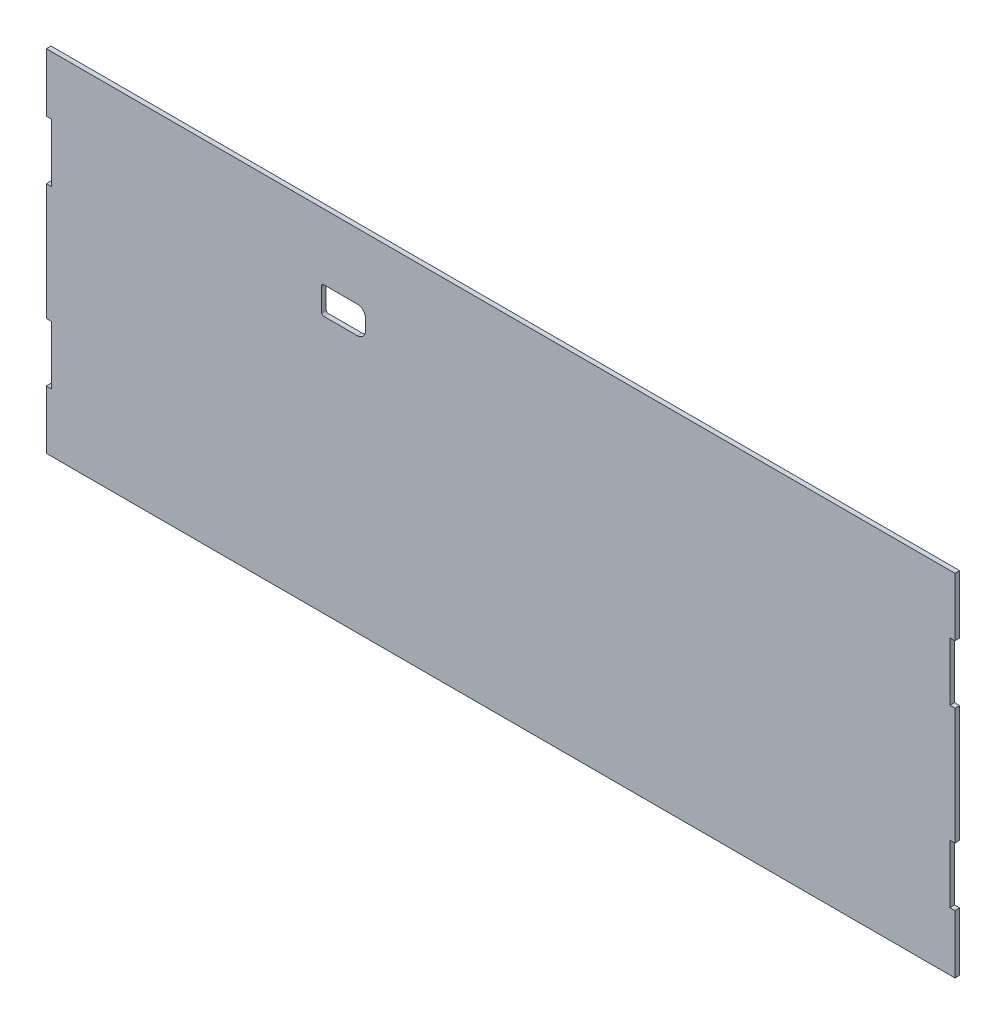
ISO-10303-21;
HEADER;
FILE_DESCRIPTION(('STEP AP214'),'2;1');
FILE_NAME('part.step','',(''),(''),'','','');
FILE_SCHEMA(('AUTOMOTIVE_DESIGN { 1 0 10303 214 1 1 1 1 }'));
ENDSEC;
DATA;
#1=APPLICATION_CONTEXT('core data for automotive mechanical design processes');
#2=APPLICATION_PROTOCOL_DEFINITION('international standard','automotive_design',2000,#1);
#3=PRODUCT_CONTEXT('',#1,'mechanical');
#4=PRODUCT('Part','Part','',(#3));
#5=PRODUCT_RELATED_PRODUCT_CATEGORY('part','',(#4));
#6=PRODUCT_DEFINITION_FORMATION('','',#4);
#7=PRODUCT_DEFINITION_CONTEXT('part definition',#1,'design');
#8=PRODUCT_DEFINITION('design','',#6,#7);
#9=PRODUCT_DEFINITION_SHAPE('','',#8);
#10=(LENGTH_UNIT() NAMED_UNIT(*) SI_UNIT(.MILLI.,.METRE.));
#11=(NAMED_UNIT(*) PLANE_ANGLE_UNIT() SI_UNIT($,.RADIAN.));
#12=(NAMED_UNIT(*) SI_UNIT($,.STERADIAN.) SOLID_ANGLE_UNIT());
#13=UNCERTAINTY_MEASURE_WITH_UNIT(LENGTH_MEASURE(1.E-05),#10,'distance_accuracy_value','');
#14=(GEOMETRIC_REPRESENTATION_CONTEXT(3) GLOBAL_UNCERTAINTY_ASSIGNED_CONTEXT((#13)) GLOBAL_UNIT_ASSIGNED_CONTEXT((#10,
#11,#12)) REPRESENTATION_CONTEXT('',''));
#15=CARTESIAN_POINT('',(0.,0.,0.));
#16=DIRECTION('',(0.,0.,1.));
#17=DIRECTION('',(1.,0.,0.));
#18=AXIS2_PLACEMENT_3D('',#15,#16,#17);
#19=CARTESIAN_POINT('',(194.45,75.,2.));
#20=DIRECTION('',(-1.,0.,0.));
#21=DIRECTION('',(0.,-1.,0.));
#22=AXIS2_PLACEMENT_3D('',#19,#20,#21);
#23=PLANE('',#22);
#24=DIRECTION('',(0.,1.,0.));
#25=VECTOR('',#24,1.);
#26=CARTESIAN_POINT('',(194.45,75.,0.));
#27=LINE('',#26,#25);
#28=CARTESIAN_POINT('',(194.45,-75.,0.));
#29=VERTEX_POINT('',#28);
#30=CARTESIAN_POINT('',(194.450000000001,-50.,0.));
#31=VERTEX_POINT('',#30);
#32=EDGE_CURVE('E456',#29,#31,#27,.T.);
#33=ORIENTED_EDGE('',*,*,#32,.T.);
#34=DIRECTION('',(0.,0.,1.));
#35=VECTOR('',#34,1.);
#36=CARTESIAN_POINT('',(194.450000000001,-50.,0.));
#37=LINE('',#36,#35);
#38=CARTESIAN_POINT('',(194.450000000001,-50.,2.));
#39=VERTEX_POINT('',#38);
#40=EDGE_CURVE('E276',#31,#39,#37,.T.);
#41=ORIENTED_EDGE('',*,*,#40,.T.);
#42=DIRECTION('',(0.,1.,0.));
#43=VECTOR('',#42,1.);
#44=CARTESIAN_POINT('',(194.45,75.,2.));
#45=LINE('',#44,#43);
#46=CARTESIAN_POINT('',(194.45,-75.,2.));
#47=VERTEX_POINT('',#46);
#48=EDGE_CURVE('E437',#47,#39,#45,.T.);
#49=ORIENTED_EDGE('',*,*,#48,.F.);
#50=DIRECTION('',(0.,0.,-1.));
#51=VECTOR('',#50,1.);
#52=CARTESIAN_POINT('',(194.45,-75.,2.));
#53=LINE('',#52,#51);
#54=EDGE_CURVE('E455',#47,#29,#53,.T.);
#55=ORIENTED_EDGE('',*,*,#54,.T.);
#56=EDGE_LOOP('',(#33,#41,#49,#55));
#57=FACE_BOUND('',#56,.T.);
#58=ADVANCED_FACE('F42',(#57),#23,.F.);
#59=CARTESIAN_POINT('',(194.450000000001,-25.,2.));
#60=VERTEX_POINT('',#59);
#61=CARTESIAN_POINT('',(194.45,25.,2.));
#62=VERTEX_POINT('',#61);
#63=EDGE_CURVE('E442',#60,#62,#45,.T.);
#64=ORIENTED_EDGE('',*,*,#63,.F.);
#65=DIRECTION('',(0.,0.,1.));
#66=VECTOR('',#65,1.);
#67=CARTESIAN_POINT('',(194.450000000001,-25.,0.));
#68=LINE('',#67,#66);
#69=CARTESIAN_POINT('',(194.450000000001,-25.,0.));
#70=VERTEX_POINT('',#69);
#71=EDGE_CURVE('E381',#70,#60,#68,.T.);
#72=ORIENTED_EDGE('',*,*,#71,.F.);
#73=CARTESIAN_POINT('',(194.45,25.,0.));
#74=VERTEX_POINT('',#73);
#75=EDGE_CURVE('E461',#70,#74,#27,.T.);
#76=ORIENTED_EDGE('',*,*,#75,.T.);
#77=DIRECTION('',(0.,0.,1.));
#78=VECTOR('',#77,1.);
#79=CARTESIAN_POINT('',(194.45,25.,0.));
#80=LINE('',#79,#78);
#81=EDGE_CURVE('E377',#74,#62,#80,.T.);
#82=ORIENTED_EDGE('',*,*,#81,.T.);
#83=EDGE_LOOP('',(#64,#72,#76,#82));
#84=FACE_BOUND('',#83,.T.);
#85=ADVANCED_FACE('F547',(#84),#23,.F.);
#86=CARTESIAN_POINT('',(-194.45,75.,2.));
#87=DIRECTION('',(1.,0.,0.));
#88=DIRECTION('',(0.,0.,-1.));
#89=AXIS2_PLACEMENT_3D('',#86,#87,#88);
#90=PLANE('',#89);
#91=DIRECTION('',(0.,-1.,0.));
#92=VECTOR('',#91,1.);
#93=CARTESIAN_POINT('',(-194.45,75.,0.));
#94=LINE('',#93,#92);
#95=CARTESIAN_POINT('',(-194.45,75.,0.));
#96=VERTEX_POINT('',#95);
#97=CARTESIAN_POINT('',(-194.45,50.,0.));
#98=VERTEX_POINT('',#97);
#99=EDGE_CURVE('E465',#96,#98,#94,.T.);
#100=ORIENTED_EDGE('',*,*,#99,.T.);
#101=DIRECTION('',(0.,0.,1.));
#102=VECTOR('',#101,1.);
#103=CARTESIAN_POINT('',(-194.45,50.,0.));
#104=LINE('',#103,#102);
#105=CARTESIAN_POINT('',(-194.45,50.,2.));
#106=VERTEX_POINT('',#105);
#107=EDGE_CURVE('E341',#98,#106,#104,.T.);
#108=ORIENTED_EDGE('',*,*,#107,.T.);
#109=DIRECTION('',(0.,-1.,0.));
#110=VECTOR('',#109,1.);
#111=CARTESIAN_POINT('',(-194.45,75.,2.));
#112=LINE('',#111,#110);
#113=CARTESIAN_POINT('',(-194.45,75.,2.));
#114=VERTEX_POINT('',#113);
#115=EDGE_CURVE('E447',#114,#106,#112,.T.);
#116=ORIENTED_EDGE('',*,*,#115,.F.);
#117=DIRECTION('',(0.,0.,-1.));
#118=VECTOR('',#117,1.);
#119=CARTESIAN_POINT('',(-194.45,75.,2.));
#120=LINE('',#119,#118);
#121=EDGE_CURVE('E480',#114,#96,#120,.T.);
#122=ORIENTED_EDGE('',*,*,#121,.T.);
#123=EDGE_LOOP('',(#100,#108,#116,#122));
#124=FACE_BOUND('',#123,.T.);
#125=ADVANCED_FACE('F552',(#124),#90,.F.);
#126=CARTESIAN_POINT('',(-194.45,25.,2.));
#127=VERTEX_POINT('',#126);
#128=CARTESIAN_POINT('',(-194.45,-25.,2.));
#129=VERTEX_POINT('',#128);
#130=EDGE_CURVE('E452',#127,#129,#112,.T.);
#131=ORIENTED_EDGE('',*,*,#130,.F.);
#132=DIRECTION('',(0.,0.,1.));
#133=VECTOR('',#132,1.);
#134=CARTESIAN_POINT('',(-194.45,25.,0.));
#135=LINE('',#134,#133);
#136=CARTESIAN_POINT('',(-194.45,25.,0.));
#137=VERTEX_POINT('',#136);
#138=EDGE_CURVE('E352',#137,#127,#135,.T.);
#139=ORIENTED_EDGE('',*,*,#138,.F.);
#140=CARTESIAN_POINT('',(-194.45,-25.,0.));
#141=VERTEX_POINT('',#140);
#142=EDGE_CURVE('E470',#137,#141,#94,.T.);
#143=ORIENTED_EDGE('',*,*,#142,.T.);
#144=DIRECTION('',(0.,0.,1.));
#145=VECTOR('',#144,1.);
#146=CARTESIAN_POINT('',(-194.45,-25.,0.));
#147=LINE('',#146,#145);
#148=EDGE_CURVE('E355',#141,#129,#147,.T.);
#149=ORIENTED_EDGE('',*,*,#148,.T.);
#150=EDGE_LOOP('',(#131,#139,#143,#149));
#151=FACE_BOUND('',#150,.T.);
#152=ADVANCED_FACE('F556',(#151),#90,.F.);
#153=CARTESIAN_POINT('',(194.45,50.,2.));
#154=VERTEX_POINT('',#153);
#155=CARTESIAN_POINT('',(194.45,75.,2.));
#156=VERTEX_POINT('',#155);
#157=EDGE_CURVE('E443',#154,#156,#45,.T.);
#158=ORIENTED_EDGE('',*,*,#157,.F.);
#159=DIRECTION('',(0.,0.,1.));
#160=VECTOR('',#159,1.);
#161=CARTESIAN_POINT('',(194.45,50.,0.));
#162=LINE('',#161,#160);
#163=CARTESIAN_POINT('',(194.45,50.,0.));
#164=VERTEX_POINT('',#163);
#165=EDGE_CURVE('E367',#164,#154,#162,.T.);
#166=ORIENTED_EDGE('',*,*,#165,.F.);
#167=CARTESIAN_POINT('',(194.45,75.,0.));
#168=VERTEX_POINT('',#167);
#169=EDGE_CURVE('E345',#164,#168,#27,.T.);
#170=ORIENTED_EDGE('',*,*,#169,.T.);
#171=DIRECTION('',(0.,0.,-1.));
#172=VECTOR('',#171,1.);
#173=CARTESIAN_POINT('',(194.45,75.,2.));
#174=LINE('',#173,#172);
#175=EDGE_CURVE('E484',#156,#168,#174,.T.);
#176=ORIENTED_EDGE('',*,*,#175,.F.);
#177=EDGE_LOOP('',(#158,#166,#170,#176));
#178=FACE_BOUND('',#177,.T.);
#179=ADVANCED_FACE('F44',(#178),#23,.F.);
#180=CARTESIAN_POINT('',(-194.45,75.,2.));
#181=DIRECTION('',(0.,-1.,0.));
#182=DIRECTION('',(0.,0.,-1.));
#183=AXIS2_PLACEMENT_3D('',#180,#181,#182);
#184=PLANE('',#183);
#185=DIRECTION('',(-1.,0.,0.));
#186=VECTOR('',#185,1.);
#187=CARTESIAN_POINT('',(-194.45,75.,0.));
#188=LINE('',#187,#186);
#189=EDGE_CURVE('E460',#168,#96,#188,.T.);
#190=ORIENTED_EDGE('',*,*,#189,.T.);
#191=ORIENTED_EDGE('',*,*,#121,.F.);
#192=DIRECTION('',(-1.,0.,0.));
#193=VECTOR('',#192,1.);
#194=CARTESIAN_POINT('',(-194.45,75.,2.));
#195=LINE('',#194,#193);
#196=EDGE_CURVE('E441',#156,#114,#195,.T.);
#197=ORIENTED_EDGE('',*,*,#196,.F.);
#198=ORIENTED_EDGE('',*,*,#175,.T.);
#199=EDGE_LOOP('',(#190,#191,#197,#198));
#200=FACE_BOUND('',#199,.T.);
#201=ADVANCED_FACE('F555',(#200),#184,.F.);
#202=CARTESIAN_POINT('',(-194.45,-50.,2.));
#203=VERTEX_POINT('',#202);
#204=CARTESIAN_POINT('',(-194.45,-75.,2.));
#205=VERTEX_POINT('',#204);
#206=EDGE_CURVE('E446',#203,#205,#112,.T.);
#207=ORIENTED_EDGE('',*,*,#206,.F.);
#208=DIRECTION('',(0.,0.,1.));
#209=VECTOR('',#208,1.);
#210=CARTESIAN_POINT('',(-194.45,-50.,0.));
#211=LINE('',#210,#209);
#212=CARTESIAN_POINT('',(-194.45,-50.,0.));
#213=VERTEX_POINT('',#212);
#214=EDGE_CURVE('E318',#213,#203,#211,.T.);
#215=ORIENTED_EDGE('',*,*,#214,.F.);
#216=CARTESIAN_POINT('',(-194.45,-75.,0.));
#217=VERTEX_POINT('',#216);
#218=EDGE_CURVE('E464',#213,#217,#94,.T.);
#219=ORIENTED_EDGE('',*,*,#218,.T.);
#220=DIRECTION('',(0.,0.,-1.));
#221=VECTOR('',#220,1.);
#222=CARTESIAN_POINT('',(-194.45,-75.,2.));
#223=LINE('',#222,#221);
#224=EDGE_CURVE('E476',#205,#217,#223,.T.);
#225=ORIENTED_EDGE('',*,*,#224,.F.);
#226=EDGE_LOOP('',(#207,#215,#219,#225));
#227=FACE_BOUND('',#226,.T.);
#228=ADVANCED_FACE('F562',(#227),#90,.F.);
#229=CARTESIAN_POINT('',(-194.45,-75.,2.));
#230=DIRECTION('',(0.,1.,0.));
#231=DIRECTION('',(0.,0.,1.));
#232=AXIS2_PLACEMENT_3D('',#229,#230,#231);
#233=PLANE('',#232);
#234=DIRECTION('',(1.,0.,0.));
#235=VECTOR('',#234,1.);
#236=CARTESIAN_POINT('',(-194.45,-75.,0.));
#237=LINE('',#236,#235);
#238=EDGE_CURVE('E469',#217,#29,#237,.T.);
#239=ORIENTED_EDGE('',*,*,#238,.T.);
#240=ORIENTED_EDGE('',*,*,#54,.F.);
#241=DIRECTION('',(1.,0.,0.));
#242=VECTOR('',#241,1.);
#243=CARTESIAN_POINT('',(-194.45,-75.,2.));
#244=LINE('',#243,#242);
#245=EDGE_CURVE('E451',#205,#47,#244,.T.);
#246=ORIENTED_EDGE('',*,*,#245,.F.);
#247=ORIENTED_EDGE('',*,*,#224,.T.);
#248=EDGE_LOOP('',(#239,#240,#246,#247));
#249=FACE_BOUND('',#248,.T.);
#250=ADVANCED_FACE('F620',(#249),#233,.F.);
#251=CARTESIAN_POINT('',(0.,0.,2.));
#252=DIRECTION('',(0.,0.,1.));
#253=DIRECTION('',(1.,0.,0.));
#254=AXIS2_PLACEMENT_3D('',#251,#252,#253);
#255=PLANE('',#254);
#256=CARTESIAN_POINT('',(-61.3789788800922,38.7073381675381,2.));
#257=DIRECTION('',(0.,0.,1.));
#258=DIRECTION('',(-1.,0.,0.));
#259=AXIS2_PLACEMENT_3D('',#256,#257,#258);
#260=CIRCLE('',#259,3.525);
#261=CARTESIAN_POINT('',(-61.3789788800922,35.1823381675381,2.));
#262=VERTEX_POINT('',#261);
#263=CARTESIAN_POINT('',(-57.8539788800922,38.7073381675381,2.));
#264=VERTEX_POINT('',#263);
#265=EDGE_CURVE('E58',#262,#264,#260,.T.);
#266=ORIENTED_EDGE('',*,*,#265,.F.);
#267=DIRECTION('',(1.,0.,0.));
#268=VECTOR('',#267,1.);
#269=CARTESIAN_POINT('',(-61.3789788800922,35.1823381675381,2.));
#270=LINE('',#269,#268);
#271=CARTESIAN_POINT('',(-75.6539788800922,35.182338167538,2.));
#272=VERTEX_POINT('',#271);
#273=EDGE_CURVE('E269',#272,#262,#270,.T.);
#274=ORIENTED_EDGE('',*,*,#273,.F.);
#275=CARTESIAN_POINT('',(-75.6539788800922,36.182338167538,2.));
#276=DIRECTION('',(0.,0.,1.));
#277=DIRECTION('',(-1.,0.,0.));
#278=AXIS2_PLACEMENT_3D('',#275,#276,#277);
#279=CIRCLE('',#278,1.00000000000001);
#280=CARTESIAN_POINT('',(-76.6539788800922,36.182338167538,2.));
#281=VERTEX_POINT('',#280);
#282=EDGE_CURVE('E265',#281,#272,#279,.T.);
#283=ORIENTED_EDGE('',*,*,#282,.F.);
#284=DIRECTION('',(0.,-1.,0.));
#285=VECTOR('',#284,1.);
#286=CARTESIAN_POINT('',(-76.6539788800922,36.182338167538,2.));
#287=LINE('',#286,#285);
#288=CARTESIAN_POINT('',(-76.6539788800923,45.8823381675379,2.));
#289=VERTEX_POINT('',#288);
#290=EDGE_CURVE('E261',#289,#281,#287,.T.);
#291=ORIENTED_EDGE('',*,*,#290,.F.);
#292=CARTESIAN_POINT('',(-75.6539788800923,45.882338167538,2.));
#293=DIRECTION('',(0.,0.,1.));
#294=DIRECTION('',(-1.,0.,0.));
#295=AXIS2_PLACEMENT_3D('',#292,#293,#294);
#296=CIRCLE('',#295,0.999999999999987);
#297=CARTESIAN_POINT('',(-75.6539788800923,46.882338167538,2.));
#298=VERTEX_POINT('',#297);
#299=EDGE_CURVE('E254',#298,#289,#296,.T.);
#300=ORIENTED_EDGE('',*,*,#299,.F.);
#301=DIRECTION('',(-1.,0.,0.));
#302=VECTOR('',#301,1.);
#303=CARTESIAN_POINT('',(-75.6539788800923,46.882338167538,2.));
#304=LINE('',#303,#302);
#305=CARTESIAN_POINT('',(-61.3789788800923,46.8823381675381,2.));
#306=VERTEX_POINT('',#305);
#307=EDGE_CURVE('E250',#306,#298,#304,.T.);
#308=ORIENTED_EDGE('',*,*,#307,.F.);
#309=CARTESIAN_POINT('',(-61.3789788800922,43.3573381675381,2.));
#310=DIRECTION('',(0.,0.,1.));
#311=DIRECTION('',(1.,0.,0.));
#312=AXIS2_PLACEMENT_3D('',#309,#310,#311);
#313=CIRCLE('',#312,3.52500000000001);
#314=CARTESIAN_POINT('',(-57.8539788800922,43.3573381675381,2.));
#315=VERTEX_POINT('',#314);
#316=EDGE_CURVE('E231',#315,#306,#313,.T.);
#317=ORIENTED_EDGE('',*,*,#316,.F.);
#318=DIRECTION('',(0.,1.,0.));
#319=VECTOR('',#318,1.);
#320=CARTESIAN_POINT('',(-57.8539788800922,38.7073381675381,2.));
#321=LINE('',#320,#319);
#322=EDGE_CURVE('E241',#264,#315,#321,.T.);
#323=ORIENTED_EDGE('',*,*,#322,.F.);
#324=EDGE_LOOP('',(#266,#274,#283,#291,#300,#308,#317,#323));
#325=FACE_BOUND('',#324,.T.);
#326=DIRECTION('',(-1.,0.,0.));
#327=VECTOR('',#326,1.);
#328=CARTESIAN_POINT('',(-194.45,50.,2.));
#329=LINE('',#328,#327);
#330=CARTESIAN_POINT('',(-192.25,50.,2.));
#331=VERTEX_POINT('',#330);
#332=EDGE_CURVE('E298',#331,#106,#329,.T.);
#333=ORIENTED_EDGE('',*,*,#332,.F.);
#334=DIRECTION('',(0.,1.,0.));
#335=VECTOR('',#334,1.);
#336=CARTESIAN_POINT('',(-192.25,50.,2.));
#337=LINE('',#336,#335);
#338=CARTESIAN_POINT('',(-192.25,25.,2.));
#339=VERTEX_POINT('',#338);
#340=EDGE_CURVE('E335',#339,#331,#337,.T.);
#341=ORIENTED_EDGE('',*,*,#340,.F.);
#342=DIRECTION('',(1.,0.,0.));
#343=VECTOR('',#342,1.);
#344=CARTESIAN_POINT('',(-192.25,25.,2.));
#345=LINE('',#344,#343);
#346=EDGE_CURVE('E331',#127,#339,#345,.T.);
#347=ORIENTED_EDGE('',*,*,#346,.F.);
#348=ORIENTED_EDGE('',*,*,#130,.T.);
#349=DIRECTION('',(-1.,0.,0.));
#350=VECTOR('',#349,1.);
#351=CARTESIAN_POINT('',(-194.45,-25.,2.));
#352=LINE('',#351,#350);
#353=CARTESIAN_POINT('',(-192.25,-25.,2.));
#354=VERTEX_POINT('',#353);
#355=EDGE_CURVE('E328',#354,#129,#352,.T.);
#356=ORIENTED_EDGE('',*,*,#355,.F.);
#357=DIRECTION('',(0.,1.,0.));
#358=VECTOR('',#357,1.);
#359=CARTESIAN_POINT('',(-192.25,-25.,2.));
#360=LINE('',#359,#358);
#361=CARTESIAN_POINT('',(-192.25,-50.,2.));
#362=VERTEX_POINT('',#361);
#363=EDGE_CURVE('E323',#362,#354,#360,.T.);
#364=ORIENTED_EDGE('',*,*,#363,.F.);
#365=DIRECTION('',(1.,0.,0.));
#366=VECTOR('',#365,1.);
#367=CARTESIAN_POINT('',(-192.25,-50.,2.));
#368=LINE('',#367,#366);
#369=EDGE_CURVE('E319',#203,#362,#368,.T.);
#370=ORIENTED_EDGE('',*,*,#369,.F.);
#371=ORIENTED_EDGE('',*,*,#206,.T.);
#372=ORIENTED_EDGE('',*,*,#245,.T.);
#373=ORIENTED_EDGE('',*,*,#48,.T.);
#374=DIRECTION('',(1.,0.,0.));
#375=VECTOR('',#374,1.);
#376=CARTESIAN_POINT('',(194.450000000001,-50.,2.));
#377=LINE('',#376,#375);
#378=CARTESIAN_POINT('',(192.250000000001,-50.,2.));
#379=VERTEX_POINT('',#378);
#380=EDGE_CURVE('E393',#379,#39,#377,.T.);
#381=ORIENTED_EDGE('',*,*,#380,.F.);
#382=DIRECTION('',(0.,-1.,0.));
#383=VECTOR('',#382,1.);
#384=CARTESIAN_POINT('',(192.250000000001,-50.,2.));
#385=LINE('',#384,#383);
#386=CARTESIAN_POINT('',(192.250000000001,-25.,2.));
#387=VERTEX_POINT('',#386);
#388=EDGE_CURVE('E396',#387,#379,#385,.T.);
#389=ORIENTED_EDGE('',*,*,#388,.F.);
#390=DIRECTION('',(-1.,0.,0.));
#391=VECTOR('',#390,1.);
#392=CARTESIAN_POINT('',(192.250000000001,-25.,2.));
#393=LINE('',#392,#391);
#394=EDGE_CURVE('E401',#60,#387,#393,.T.);
#395=ORIENTED_EDGE('',*,*,#394,.F.);
#396=ORIENTED_EDGE('',*,*,#63,.T.);
#397=DIRECTION('',(1.,0.,0.));
#398=VECTOR('',#397,1.);
#399=CARTESIAN_POINT('',(194.45,25.,2.));
#400=LINE('',#399,#398);
#401=CARTESIAN_POINT('',(192.25,25.,2.));
#402=VERTEX_POINT('',#401);
#403=EDGE_CURVE('E405',#402,#62,#400,.T.);
#404=ORIENTED_EDGE('',*,*,#403,.F.);
#405=DIRECTION('',(0.,-1.,0.));
#406=VECTOR('',#405,1.);
#407=CARTESIAN_POINT('',(192.25,25.,2.));
#408=LINE('',#407,#406);
#409=CARTESIAN_POINT('',(192.25,50.,2.));
#410=VERTEX_POINT('',#409);
#411=EDGE_CURVE('E408',#410,#402,#408,.T.);
#412=ORIENTED_EDGE('',*,*,#411,.F.);
#413=DIRECTION('',(-1.,0.,0.));
#414=VECTOR('',#413,1.);
#415=CARTESIAN_POINT('',(192.25,50.,2.));
#416=LINE('',#415,#414);
#417=EDGE_CURVE('E324',#154,#410,#416,.T.);
#418=ORIENTED_EDGE('',*,*,#417,.F.);
#419=ORIENTED_EDGE('',*,*,#157,.T.);
#420=ORIENTED_EDGE('',*,*,#196,.T.);
#421=ORIENTED_EDGE('',*,*,#115,.T.);
#422=EDGE_LOOP('',(#333,#341,#347,#348,#356,#364,#370,#371,#372,#373,#381,#389,#395,#396,#404,
#412,#418,#419,#420,#421));
#423=FACE_BOUND('',#422,.T.);
#424=ADVANCED_FACE('F246',(#325,#423),#255,.T.);
#425=CARTESIAN_POINT('',(0.,0.,0.));
#426=DIRECTION('',(0.,0.,1.));
#427=DIRECTION('',(1.,0.,0.));
#428=AXIS2_PLACEMENT_3D('',#425,#426,#427);
#429=PLANE('',#428);
#430=DIRECTION('',(1.,0.,0.));
#431=VECTOR('',#430,1.);
#432=CARTESIAN_POINT('',(-2.7362691344133E-13,35.1823381675386,0.));
#433=LINE('',#432,#431);
#434=CARTESIAN_POINT('',(-75.6539788800922,35.182338167538,0.));
#435=VERTEX_POINT('',#434);
#436=CARTESIAN_POINT('',(-61.3789788800922,35.1823381675381,0.));
#437=VERTEX_POINT('',#436);
#438=EDGE_CURVE('E51',#435,#437,#433,.T.);
#439=ORIENTED_EDGE('',*,*,#438,.T.);
#440=CARTESIAN_POINT('',(-61.3789788800922,38.7073381675381,0.));
#441=DIRECTION('',(0.,0.,1.));
#442=DIRECTION('',(1.,0.,0.));
#443=AXIS2_PLACEMENT_3D('',#440,#441,#442);
#444=CIRCLE('',#443,3.525);
#445=CARTESIAN_POINT('',(-57.8539788800922,38.7073381675381,0.));
#446=VERTEX_POINT('',#445);
#447=EDGE_CURVE('E11',#437,#446,#444,.T.);
#448=ORIENTED_EDGE('',*,*,#447,.T.);
#449=DIRECTION('',(0.,1.,0.));
#450=VECTOR('',#449,1.);
#451=CARTESIAN_POINT('',(-57.8539788800919,-5.17990479184318E-13,0.));
#452=LINE('',#451,#450);
#453=CARTESIAN_POINT('',(-57.8539788800922,43.3573381675381,0.));
#454=VERTEX_POINT('',#453);
#455=EDGE_CURVE('E488',#446,#454,#452,.T.);
#456=ORIENTED_EDGE('',*,*,#455,.T.);
#457=CARTESIAN_POINT('',(-61.3789788800922,43.3573381675381,0.));
#458=DIRECTION('',(0.,0.,1.));
#459=DIRECTION('',(1.,0.,0.));
#460=AXIS2_PLACEMENT_3D('',#457,#458,#459);
#461=CIRCLE('',#460,3.52500000000001);
#462=CARTESIAN_POINT('',(-61.3789788800923,46.8823381675381,0.));
#463=VERTEX_POINT('',#462);
#464=EDGE_CURVE('E234',#454,#463,#461,.T.);
#465=ORIENTED_EDGE('',*,*,#464,.T.);
#466=DIRECTION('',(-1.,0.,0.));
#467=VECTOR('',#466,1.);
#468=CARTESIAN_POINT('',(-2.73466819344293E-13,46.8823381675384,0.));
#469=LINE('',#468,#467);
#470=CARTESIAN_POINT('',(-75.6539788800923,46.882338167538,0.));
#471=VERTEX_POINT('',#470);
#472=EDGE_CURVE('E493',#463,#471,#469,.T.);
#473=ORIENTED_EDGE('',*,*,#472,.T.);
#474=CARTESIAN_POINT('',(-75.6539788800923,45.882338167538,0.));
#475=DIRECTION('',(0.,0.,1.));
#476=DIRECTION('',(1.,0.,0.));
#477=AXIS2_PLACEMENT_3D('',#474,#475,#476);
#478=CIRCLE('',#477,0.999999999999987);
#479=CARTESIAN_POINT('',(-76.6539788800923,45.8823381675379,0.));
#480=VERTEX_POINT('',#479);
#481=EDGE_CURVE('E497',#471,#480,#478,.T.);
#482=ORIENTED_EDGE('',*,*,#481,.T.);
#483=DIRECTION('',(0.,-1.,0.));
#484=VECTOR('',#483,1.);
#485=CARTESIAN_POINT('',(-76.653978880092,-4.38675321040253E-13,0.));
#486=LINE('',#485,#484);
#487=CARTESIAN_POINT('',(-76.6539788800922,36.182338167538,0.));
#488=VERTEX_POINT('',#487);
#489=EDGE_CURVE('E501',#480,#488,#486,.T.);
#490=ORIENTED_EDGE('',*,*,#489,.T.);
#491=CARTESIAN_POINT('',(-75.6539788800922,36.182338167538,0.));
#492=DIRECTION('',(0.,0.,1.));
#493=DIRECTION('',(1.,0.,0.));
#494=AXIS2_PLACEMENT_3D('',#491,#492,#493);
#495=CIRCLE('',#494,1.00000000000001);
#496=EDGE_CURVE('E505',#488,#435,#495,.T.);
#497=ORIENTED_EDGE('',*,*,#496,.T.);
#498=EDGE_LOOP('',(#439,#448,#456,#465,#473,#482,#490,#497));
#499=FACE_BOUND('',#498,.T.);
#500=DIRECTION('',(0.,1.,0.));
#501=VECTOR('',#500,1.);
#502=CARTESIAN_POINT('',(-192.25,50.,0.));
#503=LINE('',#502,#501);
#504=CARTESIAN_POINT('',(-192.25,25.,0.));
#505=VERTEX_POINT('',#504);
#506=CARTESIAN_POINT('',(-192.25,50.,0.));
#507=VERTEX_POINT('',#506);
#508=EDGE_CURVE('E310',#505,#507,#503,.T.);
#509=ORIENTED_EDGE('',*,*,#508,.T.);
#510=DIRECTION('',(-1.,0.,0.));
#511=VECTOR('',#510,1.);
#512=CARTESIAN_POINT('',(-194.45,50.,0.));
#513=LINE('',#512,#511);
#514=EDGE_CURVE('E314',#507,#98,#513,.T.);
#515=ORIENTED_EDGE('',*,*,#514,.T.);
#516=ORIENTED_EDGE('',*,*,#99,.F.);
#517=ORIENTED_EDGE('',*,*,#189,.F.);
#518=ORIENTED_EDGE('',*,*,#169,.F.);
#519=DIRECTION('',(-1.,0.,0.));
#520=VECTOR('',#519,1.);
#521=CARTESIAN_POINT('',(192.25,50.,0.));
#522=LINE('',#521,#520);
#523=CARTESIAN_POINT('',(192.25,50.,0.));
#524=VERTEX_POINT('',#523);
#525=EDGE_CURVE('E397',#164,#524,#522,.T.);
#526=ORIENTED_EDGE('',*,*,#525,.T.);
#527=DIRECTION('',(0.,-1.,0.));
#528=VECTOR('',#527,1.);
#529=CARTESIAN_POINT('',(192.25,25.,0.));
#530=LINE('',#529,#528);
#531=CARTESIAN_POINT('',(192.25,25.,0.));
#532=VERTEX_POINT('',#531);
#533=EDGE_CURVE('E430',#524,#532,#530,.T.);
#534=ORIENTED_EDGE('',*,*,#533,.T.);
#535=DIRECTION('',(1.,0.,0.));
#536=VECTOR('',#535,1.);
#537=CARTESIAN_POINT('',(194.45,25.,0.));
#538=LINE('',#537,#536);
#539=EDGE_CURVE('E426',#532,#74,#538,.T.);
#540=ORIENTED_EDGE('',*,*,#539,.T.);
#541=ORIENTED_EDGE('',*,*,#75,.F.);
#542=DIRECTION('',(-1.,0.,0.));
#543=VECTOR('',#542,1.);
#544=CARTESIAN_POINT('',(192.250000000001,-25.,0.));
#545=LINE('',#544,#543);
#546=CARTESIAN_POINT('',(192.250000000001,-25.,0.));
#547=VERTEX_POINT('',#546);
#548=EDGE_CURVE('E422',#70,#547,#545,.T.);
#549=ORIENTED_EDGE('',*,*,#548,.T.);
#550=DIRECTION('',(0.,-1.,0.));
#551=VECTOR('',#550,1.);
#552=CARTESIAN_POINT('',(192.250000000001,-50.,0.));
#553=LINE('',#552,#551);
#554=CARTESIAN_POINT('',(192.250000000001,-50.,0.));
#555=VERTEX_POINT('',#554);
#556=EDGE_CURVE('E418',#547,#555,#553,.T.);
#557=ORIENTED_EDGE('',*,*,#556,.T.);
#558=DIRECTION('',(1.,0.,0.));
#559=VECTOR('',#558,1.);
#560=CARTESIAN_POINT('',(194.450000000001,-50.,0.));
#561=LINE('',#560,#559);
#562=EDGE_CURVE('E370',#555,#31,#561,.T.);
#563=ORIENTED_EDGE('',*,*,#562,.T.);
#564=ORIENTED_EDGE('',*,*,#32,.F.);
#565=ORIENTED_EDGE('',*,*,#238,.F.);
#566=ORIENTED_EDGE('',*,*,#218,.F.);
#567=DIRECTION('',(1.,0.,0.));
#568=VECTOR('',#567,1.);
#569=CARTESIAN_POINT('',(-192.25,-50.,0.));
#570=LINE('',#569,#568);
#571=CARTESIAN_POINT('',(-192.25,-50.,0.));
#572=VERTEX_POINT('',#571);
#573=EDGE_CURVE('E293',#213,#572,#570,.T.);
#574=ORIENTED_EDGE('',*,*,#573,.T.);
#575=DIRECTION('',(0.,1.,0.));
#576=VECTOR('',#575,1.);
#577=CARTESIAN_POINT('',(-192.25,-25.,0.));
#578=LINE('',#577,#576);
#579=CARTESIAN_POINT('',(-192.25,-25.,0.));
#580=VERTEX_POINT('',#579);
#581=EDGE_CURVE('E297',#572,#580,#578,.T.);
#582=ORIENTED_EDGE('',*,*,#581,.T.);
#583=DIRECTION('',(-1.,0.,0.));
#584=VECTOR('',#583,1.);
#585=CARTESIAN_POINT('',(-194.45,-25.,0.));
#586=LINE('',#585,#584);
#587=EDGE_CURVE('E302',#580,#141,#586,.T.);
#588=ORIENTED_EDGE('',*,*,#587,.T.);
#589=ORIENTED_EDGE('',*,*,#142,.F.);
#590=DIRECTION('',(1.,0.,0.));
#591=VECTOR('',#590,1.);
#592=CARTESIAN_POINT('',(-192.25,25.,0.));
#593=LINE('',#592,#591);
#594=EDGE_CURVE('E306',#137,#505,#593,.T.);
#595=ORIENTED_EDGE('',*,*,#594,.T.);
#596=EDGE_LOOP('',(#509,#515,#516,#517,#518,#526,#534,#540,#541,#549,#557,#563,#564,#565,#566,
#574,#582,#588,#589,#595));
#597=FACE_BOUND('',#596,.T.);
#598=ADVANCED_FACE('F511',(#499,#597),#429,.F.);
#599=CARTESIAN_POINT('',(192.25,50.,0.));
#600=DIRECTION('',(0.,1.,0.));
#601=DIRECTION('',(-1.,0.,0.));
#602=AXIS2_PLACEMENT_3D('',#599,#600,#601);
#603=PLANE('',#602);
#604=ORIENTED_EDGE('',*,*,#417,.T.);
#605=DIRECTION('',(0.,0.,1.));
#606=VECTOR('',#605,1.);
#607=CARTESIAN_POINT('',(192.25,50.,0.));
#608=LINE('',#607,#606);
#609=EDGE_CURVE('E371',#524,#410,#608,.T.);
#610=ORIENTED_EDGE('',*,*,#609,.F.);
#611=ORIENTED_EDGE('',*,*,#525,.F.);
#612=ORIENTED_EDGE('',*,*,#165,.T.);
#613=EDGE_LOOP('',(#604,#610,#611,#612));
#614=FACE_BOUND('',#613,.T.);
#615=ADVANCED_FACE('F591',(#614),#603,.F.);
#616=CARTESIAN_POINT('',(192.25,25.,0.));
#617=DIRECTION('',(-1.,0.,0.));
#618=DIRECTION('',(0.,-1.,0.));
#619=AXIS2_PLACEMENT_3D('',#616,#617,#618);
#620=PLANE('',#619);
#621=ORIENTED_EDGE('',*,*,#411,.T.);
#622=DIRECTION('',(0.,0.,1.));
#623=VECTOR('',#622,1.);
#624=CARTESIAN_POINT('',(192.25,25.,0.));
#625=LINE('',#624,#623);
#626=EDGE_CURVE('E374',#532,#402,#625,.T.);
#627=ORIENTED_EDGE('',*,*,#626,.F.);
#628=ORIENTED_EDGE('',*,*,#533,.F.);
#629=ORIENTED_EDGE('',*,*,#609,.T.);
#630=EDGE_LOOP('',(#621,#627,#628,#629));
#631=FACE_BOUND('',#630,.T.);
#632=ADVANCED_FACE('F589',(#631),#620,.F.);
#633=CARTESIAN_POINT('',(194.45,25.,0.));
#634=DIRECTION('',(0.,-1.,0.));
#635=DIRECTION('',(1.,0.,0.));
#636=AXIS2_PLACEMENT_3D('',#633,#634,#635);
#637=PLANE('',#636);
#638=ORIENTED_EDGE('',*,*,#403,.T.);
#639=ORIENTED_EDGE('',*,*,#81,.F.);
#640=ORIENTED_EDGE('',*,*,#539,.F.);
#641=ORIENTED_EDGE('',*,*,#626,.T.);
#642=EDGE_LOOP('',(#638,#639,#640,#641));
#643=FACE_BOUND('',#642,.T.);
#644=ADVANCED_FACE('F586',(#643),#637,.F.);
#645=CARTESIAN_POINT('',(194.450000000001,-50.,0.));
#646=DIRECTION('',(0.,-1.,0.));
#647=DIRECTION('',(0.,0.,-1.));
#648=AXIS2_PLACEMENT_3D('',#645,#646,#647);
#649=PLANE('',#648);
#650=ORIENTED_EDGE('',*,*,#380,.T.);
#651=ORIENTED_EDGE('',*,*,#40,.F.);
#652=ORIENTED_EDGE('',*,*,#562,.F.);
#653=DIRECTION('',(0.,0.,1.));
#654=VECTOR('',#653,1.);
#655=CARTESIAN_POINT('',(192.250000000001,-50.,0.));
#656=LINE('',#655,#654);
#657=EDGE_CURVE('E387',#555,#379,#656,.T.);
#658=ORIENTED_EDGE('',*,*,#657,.T.);
#659=EDGE_LOOP('',(#650,#651,#652,#658));
#660=FACE_BOUND('',#659,.T.);
#661=ADVANCED_FACE('F607',(#660),#649,.F.);
#662=CARTESIAN_POINT('',(192.250000000001,-50.,0.));
#663=DIRECTION('',(-1.,0.,0.));
#664=DIRECTION('',(0.,-1.,0.));
#665=AXIS2_PLACEMENT_3D('',#662,#663,#664);
#666=PLANE('',#665);
#667=ORIENTED_EDGE('',*,*,#388,.T.);
#668=ORIENTED_EDGE('',*,*,#657,.F.);
#669=ORIENTED_EDGE('',*,*,#556,.F.);
#670=DIRECTION('',(0.,0.,1.));
#671=VECTOR('',#670,1.);
#672=CARTESIAN_POINT('',(192.250000000001,-25.,0.));
#673=LINE('',#672,#671);
#674=EDGE_CURVE('E384',#547,#387,#673,.T.);
#675=ORIENTED_EDGE('',*,*,#674,.T.);
#676=EDGE_LOOP('',(#667,#668,#669,#675));
#677=FACE_BOUND('',#676,.T.);
#678=ADVANCED_FACE('F611',(#677),#666,.F.);
#679=CARTESIAN_POINT('',(192.250000000001,-25.,0.));
#680=DIRECTION('',(0.,1.,0.));
#681=DIRECTION('',(0.,0.,1.));
#682=AXIS2_PLACEMENT_3D('',#679,#680,#681);
#683=PLANE('',#682);
#684=ORIENTED_EDGE('',*,*,#394,.T.);
#685=ORIENTED_EDGE('',*,*,#674,.F.);
#686=ORIENTED_EDGE('',*,*,#548,.F.);
#687=ORIENTED_EDGE('',*,*,#71,.T.);
#688=EDGE_LOOP('',(#684,#685,#686,#687));
#689=FACE_BOUND('',#688,.T.);
#690=ADVANCED_FACE('F608',(#689),#683,.F.);
#691=CARTESIAN_POINT('',(-192.25,-50.,0.));
#692=DIRECTION('',(0.,-1.,0.));
#693=DIRECTION('',(1.,0.,0.));
#694=AXIS2_PLACEMENT_3D('',#691,#692,#693);
#695=PLANE('',#694);
#696=ORIENTED_EDGE('',*,*,#369,.T.);
#697=DIRECTION('',(0.,0.,1.));
#698=VECTOR('',#697,1.);
#699=CARTESIAN_POINT('',(-192.25,-50.,0.));
#700=LINE('',#699,#698);
#701=EDGE_CURVE('E362',#572,#362,#700,.T.);
#702=ORIENTED_EDGE('',*,*,#701,.F.);
#703=ORIENTED_EDGE('',*,*,#573,.F.);
#704=ORIENTED_EDGE('',*,*,#214,.T.);
#705=EDGE_LOOP('',(#696,#702,#703,#704));
#706=FACE_BOUND('',#705,.T.);
#707=ADVANCED_FACE('F602',(#706),#695,.F.);
#708=CARTESIAN_POINT('',(-192.25,-25.,0.));
#709=DIRECTION('',(1.,0.,0.));
#710=DIRECTION('',(0.,0.,-1.));
#711=AXIS2_PLACEMENT_3D('',#708,#709,#710);
#712=PLANE('',#711);
#713=ORIENTED_EDGE('',*,*,#363,.T.);
#714=DIRECTION('',(0.,0.,1.));
#715=VECTOR('',#714,1.);
#716=CARTESIAN_POINT('',(-192.25,-25.,0.));
#717=LINE('',#716,#715);
#718=EDGE_CURVE('E359',#580,#354,#717,.T.);
#719=ORIENTED_EDGE('',*,*,#718,.F.);
#720=ORIENTED_EDGE('',*,*,#581,.F.);
#721=ORIENTED_EDGE('',*,*,#701,.T.);
#722=EDGE_LOOP('',(#713,#719,#720,#721));
#723=FACE_BOUND('',#722,.T.);
#724=ADVANCED_FACE('F670',(#723),#712,.F.);
#725=CARTESIAN_POINT('',(-194.45,-25.,0.));
#726=DIRECTION('',(0.,1.,0.));
#727=DIRECTION('',(0.,0.,1.));
#728=AXIS2_PLACEMENT_3D('',#725,#726,#727);
#729=PLANE('',#728);
#730=ORIENTED_EDGE('',*,*,#355,.T.);
#731=ORIENTED_EDGE('',*,*,#148,.F.);
#732=ORIENTED_EDGE('',*,*,#587,.F.);
#733=ORIENTED_EDGE('',*,*,#718,.T.);
#734=EDGE_LOOP('',(#730,#731,#732,#733));
#735=FACE_BOUND('',#734,.T.);
#736=ADVANCED_FACE('F668',(#735),#729,.F.);
#737=CARTESIAN_POINT('',(-194.45,50.,0.));
#738=DIRECTION('',(0.,1.,0.));
#739=DIRECTION('',(0.,0.,1.));
#740=AXIS2_PLACEMENT_3D('',#737,#738,#739);
#741=PLANE('',#740);
#742=ORIENTED_EDGE('',*,*,#332,.T.);
#743=ORIENTED_EDGE('',*,*,#107,.F.);
#744=ORIENTED_EDGE('',*,*,#514,.F.);
#745=DIRECTION('',(0.,0.,1.));
#746=VECTOR('',#745,1.);
#747=CARTESIAN_POINT('',(-192.25,50.,0.));
#748=LINE('',#747,#746);
#749=EDGE_CURVE('E346',#507,#331,#748,.T.);
#750=ORIENTED_EDGE('',*,*,#749,.T.);
#751=EDGE_LOOP('',(#742,#743,#744,#750));
#752=FACE_BOUND('',#751,.T.);
#753=ADVANCED_FACE('F639',(#752),#741,.F.);
#754=CARTESIAN_POINT('',(-192.25,50.,0.));
#755=DIRECTION('',(1.,0.,0.));
#756=DIRECTION('',(0.,0.,-1.));
#757=AXIS2_PLACEMENT_3D('',#754,#755,#756);
#758=PLANE('',#757);
#759=ORIENTED_EDGE('',*,*,#340,.T.);
#760=ORIENTED_EDGE('',*,*,#749,.F.);
#761=ORIENTED_EDGE('',*,*,#508,.F.);
#762=DIRECTION('',(0.,0.,1.));
#763=VECTOR('',#762,1.);
#764=CARTESIAN_POINT('',(-192.25,25.,0.));
#765=LINE('',#764,#763);
#766=EDGE_CURVE('E349',#505,#339,#765,.T.);
#767=ORIENTED_EDGE('',*,*,#766,.T.);
#768=EDGE_LOOP('',(#759,#760,#761,#767));
#769=FACE_BOUND('',#768,.T.);
#770=ADVANCED_FACE('F541',(#769),#758,.F.);
#771=CARTESIAN_POINT('',(-192.25,25.,0.));
#772=DIRECTION('',(0.,-1.,0.));
#773=DIRECTION('',(0.,0.,-1.));
#774=AXIS2_PLACEMENT_3D('',#771,#772,#773);
#775=PLANE('',#774);
#776=ORIENTED_EDGE('',*,*,#346,.T.);
#777=ORIENTED_EDGE('',*,*,#766,.F.);
#778=ORIENTED_EDGE('',*,*,#594,.F.);
#779=ORIENTED_EDGE('',*,*,#138,.T.);
#780=EDGE_LOOP('',(#776,#777,#778,#779));
#781=FACE_BOUND('',#780,.T.);
#782=ADVANCED_FACE('F534',(#781),#775,.F.);
#783=CARTESIAN_POINT('',(-61.3789788800922,38.7073381675381,-8.));
#784=DIRECTION('',(0.,0.,1.));
#785=DIRECTION('',(1.,0.,0.));
#786=AXIS2_PLACEMENT_3D('',#783,#784,#785);
#787=CYLINDRICAL_SURFACE('',#786,3.525);
#788=DIRECTION('',(0.,0.,1.));
#789=VECTOR('',#788,1.);
#790=CARTESIAN_POINT('',(-61.3789788800922,35.1823381675381,-8.));
#791=LINE('',#790,#789);
#792=EDGE_CURVE('E273',#437,#262,#791,.T.);
#793=ORIENTED_EDGE('',*,*,#792,.T.);
#794=ORIENTED_EDGE('',*,*,#265,.T.);
#795=DIRECTION('',(0.,0.,1.));
#796=VECTOR('',#795,1.);
#797=CARTESIAN_POINT('',(-57.8539788800922,38.7073381675381,-8.));
#798=LINE('',#797,#796);
#799=EDGE_CURVE('E238',#446,#264,#798,.T.);
#800=ORIENTED_EDGE('',*,*,#799,.F.);
#801=ORIENTED_EDGE('',*,*,#447,.F.);
#802=EDGE_LOOP('',(#793,#794,#800,#801));
#803=FACE_BOUND('',#802,.T.);
#804=ADVANCED_FACE('F532',(#803),#787,.F.);
#805=CARTESIAN_POINT('',(-61.3789788800922,35.1823381675381,-8.));
#806=DIRECTION('',(0.,-1.,0.));
#807=DIRECTION('',(1.,0.,0.));
#808=AXIS2_PLACEMENT_3D('',#805,#806,#807);
#809=PLANE('',#808);
#810=DIRECTION('',(0.,0.,1.));
#811=VECTOR('',#810,1.);
#812=CARTESIAN_POINT('',(-75.6539788800922,35.182338167538,-8.));
#813=LINE('',#812,#811);
#814=EDGE_CURVE('E277',#435,#272,#813,.T.);
#815=ORIENTED_EDGE('',*,*,#814,.T.);
#816=ORIENTED_EDGE('',*,*,#273,.T.);
#817=ORIENTED_EDGE('',*,*,#792,.F.);
#818=ORIENTED_EDGE('',*,*,#438,.F.);
#819=EDGE_LOOP('',(#815,#816,#817,#818));
#820=FACE_BOUND('',#819,.T.);
#821=ADVANCED_FACE('F516',(#820),#809,.F.);
#822=CARTESIAN_POINT('',(-75.6539788800922,36.182338167538,-8.));
#823=DIRECTION('',(0.,0.,1.));
#824=DIRECTION('',(1.,0.,0.));
#825=AXIS2_PLACEMENT_3D('',#822,#823,#824);
#826=CYLINDRICAL_SURFACE('',#825,1.00000000000001);
#827=DIRECTION('',(0.,0.,1.));
#828=VECTOR('',#827,1.);
#829=CARTESIAN_POINT('',(-76.6539788800922,36.182338167538,-8.));
#830=LINE('',#829,#828);
#831=EDGE_CURVE('E280',#488,#281,#830,.T.);
#832=ORIENTED_EDGE('',*,*,#831,.T.);
#833=ORIENTED_EDGE('',*,*,#282,.T.);
#834=ORIENTED_EDGE('',*,*,#814,.F.);
#835=ORIENTED_EDGE('',*,*,#496,.F.);
#836=EDGE_LOOP('',(#832,#833,#834,#835));
#837=FACE_BOUND('',#836,.T.);
#838=ADVANCED_FACE('F518',(#837),#826,.F.);
#839=CARTESIAN_POINT('',(-76.6539788800922,36.182338167538,-8.));
#840=DIRECTION('',(-1.,0.,0.));
#841=DIRECTION('',(0.,-1.,0.));
#842=AXIS2_PLACEMENT_3D('',#839,#840,#841);
#843=PLANE('',#842);
#844=DIRECTION('',(0.,0.,1.));
#845=VECTOR('',#844,1.);
#846=CARTESIAN_POINT('',(-76.6539788800923,45.8823381675379,-8.));
#847=LINE('',#846,#845);
#848=EDGE_CURVE('E283',#480,#289,#847,.T.);
#849=ORIENTED_EDGE('',*,*,#848,.T.);
#850=ORIENTED_EDGE('',*,*,#290,.T.);
#851=ORIENTED_EDGE('',*,*,#831,.F.);
#852=ORIENTED_EDGE('',*,*,#489,.F.);
#853=EDGE_LOOP('',(#849,#850,#851,#852));
#854=FACE_BOUND('',#853,.T.);
#855=ADVANCED_FACE('F525',(#854),#843,.F.);
#856=CARTESIAN_POINT('',(-75.6539788800923,45.882338167538,-8.));
#857=DIRECTION('',(0.,0.,1.));
#858=DIRECTION('',(1.,0.,0.));
#859=AXIS2_PLACEMENT_3D('',#856,#857,#858);
#860=CYLINDRICAL_SURFACE('',#859,0.999999999999987);
#861=DIRECTION('',(0.,0.,1.));
#862=VECTOR('',#861,1.);
#863=CARTESIAN_POINT('',(-75.6539788800923,46.882338167538,-8.));
#864=LINE('',#863,#862);
#865=EDGE_CURVE('E286',#471,#298,#864,.T.);
#866=ORIENTED_EDGE('',*,*,#865,.T.);
#867=ORIENTED_EDGE('',*,*,#299,.T.);
#868=ORIENTED_EDGE('',*,*,#848,.F.);
#869=ORIENTED_EDGE('',*,*,#481,.F.);
#870=EDGE_LOOP('',(#866,#867,#868,#869));
#871=FACE_BOUND('',#870,.T.);
#872=ADVANCED_FACE('F528',(#871),#860,.F.);
#873=CARTESIAN_POINT('',(-75.6539788800923,46.882338167538,-8.));
#874=DIRECTION('',(0.,1.,0.));
#875=DIRECTION('',(-1.,0.,0.));
#876=AXIS2_PLACEMENT_3D('',#873,#874,#875);
#877=PLANE('',#876);
#878=DIRECTION('',(0.,0.,1.));
#879=VECTOR('',#878,1.);
#880=CARTESIAN_POINT('',(-61.3789788800923,46.8823381675381,-8.));
#881=LINE('',#880,#879);
#882=EDGE_CURVE('E237',#463,#306,#881,.T.);
#883=ORIENTED_EDGE('',*,*,#882,.T.);
#884=ORIENTED_EDGE('',*,*,#307,.T.);
#885=ORIENTED_EDGE('',*,*,#865,.F.);
#886=ORIENTED_EDGE('',*,*,#472,.F.);
#887=EDGE_LOOP('',(#883,#884,#885,#886));
#888=FACE_BOUND('',#887,.T.);
#889=ADVANCED_FACE('F531',(#888),#877,.F.);
#890=CARTESIAN_POINT('',(-61.3789788800922,43.3573381675381,-8.));
#891=DIRECTION('',(0.,0.,1.));
#892=DIRECTION('',(1.,0.,0.));
#893=AXIS2_PLACEMENT_3D('',#890,#891,#892);
#894=CYLINDRICAL_SURFACE('',#893,3.52500000000001);
#895=DIRECTION('',(0.,0.,1.));
#896=VECTOR('',#895,1.);
#897=CARTESIAN_POINT('',(-57.8539788800922,43.3573381675381,-8.));
#898=LINE('',#897,#896);
#899=EDGE_CURVE('E66',#454,#315,#898,.T.);
#900=ORIENTED_EDGE('',*,*,#899,.T.);
#901=ORIENTED_EDGE('',*,*,#316,.T.);
#902=ORIENTED_EDGE('',*,*,#882,.F.);
#903=ORIENTED_EDGE('',*,*,#464,.F.);
#904=EDGE_LOOP('',(#900,#901,#902,#903));
#905=FACE_BOUND('',#904,.T.);
#906=ADVANCED_FACE('F228',(#905),#894,.F.);
#907=CARTESIAN_POINT('',(-57.8539788800922,38.7073381675381,-8.));
#908=DIRECTION('',(1.,0.,0.));
#909=DIRECTION('',(0.,1.,0.));
#910=AXIS2_PLACEMENT_3D('',#907,#908,#909);
#911=PLANE('',#910);
#912=ORIENTED_EDGE('',*,*,#799,.T.);
#913=ORIENTED_EDGE('',*,*,#322,.T.);
#914=ORIENTED_EDGE('',*,*,#899,.F.);
#915=ORIENTED_EDGE('',*,*,#455,.F.);
#916=EDGE_LOOP('',(#912,#913,#914,#915));
#917=FACE_BOUND('',#916,.T.);
#918=ADVANCED_FACE('F242',(#917),#911,.F.);
#919=CLOSED_SHELL('',(#58,#85,#125,#152,#179,#201,#228,#250,#424,#598,#615,#632,#644,#661,#678,
#690,#707,#724,#736,#753,#770,#782,#804,#821,#838,#855,#872,#889,#906,#918));
#920=MANIFOLD_SOLID_BREP('B2',#919);
#921=ADVANCED_BREP_SHAPE_REPRESENTATION('',(#18,#920),#14);
#922=SHAPE_DEFINITION_REPRESENTATION(#9,#921);
ENDSEC;
END-ISO-10303-21;
